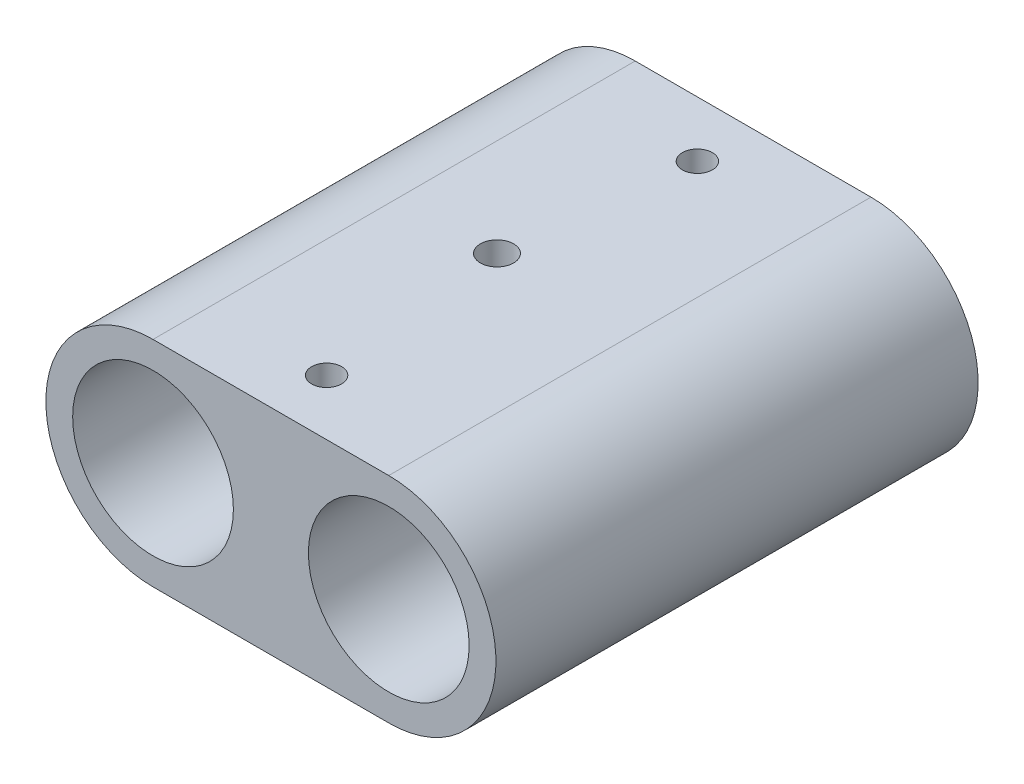
ISO-10303-21;
HEADER;
FILE_DESCRIPTION(('STEP AP214'),'2;1');
FILE_NAME('part.step','',(''),(''),'','','');
FILE_SCHEMA(('AUTOMOTIVE_DESIGN { 1 0 10303 214 1 1 1 1 }'));
ENDSEC;
DATA;
#1=APPLICATION_CONTEXT('core data for automotive mechanical design processes');
#2=APPLICATION_PROTOCOL_DEFINITION('international standard','automotive_design',2000,#1);
#3=PRODUCT_CONTEXT('',#1,'mechanical');
#4=PRODUCT('Part','Part','',(#3));
#5=PRODUCT_RELATED_PRODUCT_CATEGORY('part','',(#4));
#6=PRODUCT_DEFINITION_FORMATION('','',#4);
#7=PRODUCT_DEFINITION_CONTEXT('part definition',#1,'design');
#8=PRODUCT_DEFINITION('design','',#6,#7);
#9=PRODUCT_DEFINITION_SHAPE('','',#8);
#10=(LENGTH_UNIT() NAMED_UNIT(*) SI_UNIT(.MILLI.,.METRE.));
#11=(NAMED_UNIT(*) PLANE_ANGLE_UNIT() SI_UNIT($,.RADIAN.));
#12=(NAMED_UNIT(*) SI_UNIT($,.STERADIAN.) SOLID_ANGLE_UNIT());
#13=UNCERTAINTY_MEASURE_WITH_UNIT(LENGTH_MEASURE(1.E-05),#10,'distance_accuracy_value','');
#14=(GEOMETRIC_REPRESENTATION_CONTEXT(3) GLOBAL_UNCERTAINTY_ASSIGNED_CONTEXT((#13)) GLOBAL_UNIT_ASSIGNED_CONTEXT((#10,
#11,#12)) REPRESENTATION_CONTEXT('',''));
#15=CARTESIAN_POINT('',(0.,0.,0.));
#16=DIRECTION('',(0.,0.,1.));
#17=DIRECTION('',(1.,0.,0.));
#18=AXIS2_PLACEMENT_3D('',#15,#16,#17);
#19=CARTESIAN_POINT('',(0.,-10.,35.8));
#20=DIRECTION('',(0.,1.,0.));
#21=DIRECTION('',(-1.,0.,0.));
#22=AXIS2_PLACEMENT_3D('',#19,#20,#21);
#23=CYLINDRICAL_SURFACE('',#22,1.4);
#24=CARTESIAN_POINT('',(0.,10.,35.8));
#25=DIRECTION('',(0.,1.,0.));
#26=DIRECTION('',(-1.,0.,0.));
#27=AXIS2_PLACEMENT_3D('',#24,#25,#26);
#28=CIRCLE('',#27,1.4);
#29=CARTESIAN_POINT('',(-1.4,10.,35.8));
#30=VERTEX_POINT('',#29);
#31=EDGE_CURVE('E160',#30,#30,#28,.T.);
#32=ORIENTED_EDGE('',*,*,#31,.T.);
#33=EDGE_LOOP('',(#32));
#34=FACE_BOUND('',#33,.T.);
#35=CARTESIAN_POINT('',(0.,-7.,35.8));
#36=DIRECTION('',(0.,-1.,0.));
#37=DIRECTION('',(1.,0.,0.));
#38=AXIS2_PLACEMENT_3D('',#35,#36,#37);
#39=CIRCLE('',#38,1.4);
#40=CARTESIAN_POINT('',(1.4,-7.,35.8));
#41=VERTEX_POINT('',#40);
#42=EDGE_CURVE('E48',#41,#41,#39,.F.);
#43=ORIENTED_EDGE('',*,*,#42,.F.);
#44=EDGE_LOOP('',(#43));
#45=FACE_BOUND('',#44,.T.);
#46=ADVANCED_FACE('F44',(#34,#45),#23,.F.);
#47=CARTESIAN_POINT('',(0.,-10.,1.19999999999999));
#48=DIRECTION('',(0.,1.,0.));
#49=DIRECTION('',(-1.,0.,0.));
#50=AXIS2_PLACEMENT_3D('',#47,#48,#49);
#51=CYLINDRICAL_SURFACE('',#50,1.4);
#52=CARTESIAN_POINT('',(0.,10.,1.19999999999999));
#53=DIRECTION('',(0.,1.,0.));
#54=DIRECTION('',(-1.,0.,0.));
#55=AXIS2_PLACEMENT_3D('',#52,#53,#54);
#56=CIRCLE('',#55,1.4);
#57=CARTESIAN_POINT('',(-1.4,10.,1.19999999999999));
#58=VERTEX_POINT('',#57);
#59=EDGE_CURVE('E175',#58,#58,#56,.T.);
#60=ORIENTED_EDGE('',*,*,#59,.T.);
#61=EDGE_LOOP('',(#60));
#62=FACE_BOUND('',#61,.T.);
#63=CARTESIAN_POINT('',(0.,-7.,1.19999999999999));
#64=DIRECTION('',(0.,-1.,0.));
#65=DIRECTION('',(1.,0.,0.));
#66=AXIS2_PLACEMENT_3D('',#63,#64,#65);
#67=CIRCLE('',#66,1.4);
#68=CARTESIAN_POINT('',(1.4,-7.,1.19999999999999));
#69=VERTEX_POINT('',#68);
#70=EDGE_CURVE('E154',#69,#69,#67,.F.);
#71=ORIENTED_EDGE('',*,*,#70,.F.);
#72=EDGE_LOOP('',(#71));
#73=FACE_BOUND('',#72,.T.);
#74=ADVANCED_FACE('F201',(#62,#73),#51,.F.);
#75=CARTESIAN_POINT('',(-11.,0.,37.));
#76=DIRECTION('',(0.,0.,-1.));
#77=DIRECTION('',(-1.,0.,0.));
#78=AXIS2_PLACEMENT_3D('',#75,#76,#77);
#79=CYLINDRICAL_SURFACE('',#78,10.);
#80=DIRECTION('',(0.,0.,-1.));
#81=VECTOR('',#80,1.);
#82=CARTESIAN_POINT('',(-11.,10.,37.));
#83=LINE('',#82,#81);
#84=CARTESIAN_POINT('',(-11.,10.,41.));
#85=VERTEX_POINT('',#84);
#86=CARTESIAN_POINT('',(-11.,10.,-4.));
#87=VERTEX_POINT('',#86);
#88=EDGE_CURVE('E61',#85,#87,#83,.T.);
#89=ORIENTED_EDGE('',*,*,#88,.T.);
#90=CARTESIAN_POINT('',(-11.,0.,-4.));
#91=DIRECTION('',(0.,0.,-1.));
#92=DIRECTION('',(1.,0.,0.));
#93=AXIS2_PLACEMENT_3D('',#90,#91,#92);
#94=CIRCLE('',#93,10.);
#95=CARTESIAN_POINT('',(-11.,-10.,-4.));
#96=VERTEX_POINT('',#95);
#97=EDGE_CURVE('E102',#96,#87,#94,.T.);
#98=ORIENTED_EDGE('',*,*,#97,.F.);
#99=DIRECTION('',(0.,0.,-1.));
#100=VECTOR('',#99,1.);
#101=CARTESIAN_POINT('',(-11.,-10.,37.));
#102=LINE('',#101,#100);
#103=CARTESIAN_POINT('',(-11.,-10.,41.));
#104=VERTEX_POINT('',#103);
#105=EDGE_CURVE('E53',#104,#96,#102,.T.);
#106=ORIENTED_EDGE('',*,*,#105,.F.);
#107=CARTESIAN_POINT('',(-11.,0.,41.));
#108=DIRECTION('',(0.,0.,1.));
#109=DIRECTION('',(1.,0.,0.));
#110=AXIS2_PLACEMENT_3D('',#107,#108,#109);
#111=CIRCLE('',#110,10.);
#112=EDGE_CURVE('E123',#85,#104,#111,.T.);
#113=ORIENTED_EDGE('',*,*,#112,.F.);
#114=EDGE_LOOP('',(#89,#98,#106,#113));
#115=FACE_BOUND('',#114,.T.);
#116=ADVANCED_FACE('F206',(#115),#79,.T.);
#117=CARTESIAN_POINT('',(-11.,-10.,37.));
#118=DIRECTION('',(0.,1.,0.));
#119=DIRECTION('',(-1.,0.,0.));
#120=AXIS2_PLACEMENT_3D('',#117,#118,#119);
#121=PLANE('',#120);
#122=CARTESIAN_POINT('',(0.,-10.,35.8));
#123=DIRECTION('',(0.,-1.,0.));
#124=DIRECTION('',(1.,0.,0.));
#125=AXIS2_PLACEMENT_3D('',#122,#123,#124);
#126=CIRCLE('',#125,2.75);
#127=CARTESIAN_POINT('',(2.75000000000001,-10.,35.8));
#128=VERTEX_POINT('',#127);
#129=EDGE_CURVE('E162',#128,#128,#126,.T.);
#130=ORIENTED_EDGE('',*,*,#129,.F.);
#131=EDGE_LOOP('',(#130));
#132=FACE_BOUND('',#131,.T.);
#133=CARTESIAN_POINT('',(0.,-10.,1.19999999999999));
#134=DIRECTION('',(0.,-1.,0.));
#135=DIRECTION('',(1.,0.,0.));
#136=AXIS2_PLACEMENT_3D('',#133,#134,#135);
#137=CIRCLE('',#136,2.75);
#138=CARTESIAN_POINT('',(2.75,-10.,1.19999999999999));
#139=VERTEX_POINT('',#138);
#140=EDGE_CURVE('E172',#139,#139,#137,.T.);
#141=ORIENTED_EDGE('',*,*,#140,.F.);
#142=EDGE_LOOP('',(#141));
#143=FACE_BOUND('',#142,.T.);
#144=CARTESIAN_POINT('',(-4.,-10.,32.5));
#145=DIRECTION('',(0.,-1.,0.));
#146=DIRECTION('',(1.,0.,0.));
#147=AXIS2_PLACEMENT_3D('',#144,#145,#146);
#148=CIRCLE('',#147,1.3);
#149=CARTESIAN_POINT('',(-2.69999999999999,-10.,32.5));
#150=VERTEX_POINT('',#149);
#151=EDGE_CURVE('E136',#150,#150,#148,.T.);
#152=ORIENTED_EDGE('',*,*,#151,.F.);
#153=EDGE_LOOP('',(#152));
#154=FACE_BOUND('',#153,.T.);
#155=CARTESIAN_POINT('',(4.,-10.,4.5));
#156=DIRECTION('',(0.,-1.,0.));
#157=DIRECTION('',(1.,0.,0.));
#158=AXIS2_PLACEMENT_3D('',#155,#156,#157);
#159=CIRCLE('',#158,1.3);
#160=CARTESIAN_POINT('',(5.3,-10.,4.5));
#161=VERTEX_POINT('',#160);
#162=EDGE_CURVE('E131',#161,#161,#159,.T.);
#163=ORIENTED_EDGE('',*,*,#162,.F.);
#164=EDGE_LOOP('',(#163));
#165=FACE_BOUND('',#164,.T.);
#166=CARTESIAN_POINT('',(-1.9,-10.,18.));
#167=DIRECTION('',(0.,-1.,0.));
#168=DIRECTION('',(1.,0.,0.));
#169=AXIS2_PLACEMENT_3D('',#166,#167,#168);
#170=CIRCLE('',#169,2.75);
#171=CARTESIAN_POINT('',(0.850000000000001,-10.,18.));
#172=VERTEX_POINT('',#171);
#173=EDGE_CURVE('E146',#172,#172,#170,.T.);
#174=ORIENTED_EDGE('',*,*,#173,.F.);
#175=EDGE_LOOP('',(#174));
#176=FACE_BOUND('',#175,.T.);
#177=ORIENTED_EDGE('',*,*,#105,.T.);
#178=DIRECTION('',(-1.,0.,0.));
#179=VECTOR('',#178,1.);
#180=CARTESIAN_POINT('',(11.,-10.,-4.));
#181=LINE('',#180,#179);
#182=CARTESIAN_POINT('',(11.,-10.,-4.));
#183=VERTEX_POINT('',#182);
#184=EDGE_CURVE('E97',#183,#96,#181,.T.);
#185=ORIENTED_EDGE('',*,*,#184,.F.);
#186=DIRECTION('',(0.,0.,-1.));
#187=VECTOR('',#186,1.);
#188=CARTESIAN_POINT('',(11.,-10.,37.));
#189=LINE('',#188,#187);
#190=CARTESIAN_POINT('',(11.0000000000001,-10.,41.));
#191=VERTEX_POINT('',#190);
#192=EDGE_CURVE('E86',#191,#183,#189,.T.);
#193=ORIENTED_EDGE('',*,*,#192,.F.);
#194=DIRECTION('',(1.,0.,0.));
#195=VECTOR('',#194,1.);
#196=CARTESIAN_POINT('',(-11.,-10.,41.));
#197=LINE('',#196,#195);
#198=EDGE_CURVE('E126',#104,#191,#197,.T.);
#199=ORIENTED_EDGE('',*,*,#198,.F.);
#200=EDGE_LOOP('',(#177,#185,#193,#199));
#201=FACE_BOUND('',#200,.T.);
#202=ADVANCED_FACE('F98',(#132,#143,#154,#165,#176,#201),#121,.F.);
#203=CARTESIAN_POINT('',(11.,0.,37.));
#204=DIRECTION('',(0.,0.,-1.));
#205=DIRECTION('',(-1.,0.,0.));
#206=AXIS2_PLACEMENT_3D('',#203,#204,#205);
#207=CYLINDRICAL_SURFACE('',#206,10.);
#208=ORIENTED_EDGE('',*,*,#192,.T.);
#209=CARTESIAN_POINT('',(11.,0.,-4.));
#210=DIRECTION('',(0.,0.,-1.));
#211=DIRECTION('',(-1.,0.,0.));
#212=AXIS2_PLACEMENT_3D('',#209,#210,#211);
#213=CIRCLE('',#212,10.);
#214=CARTESIAN_POINT('',(11.,10.,-4.));
#215=VERTEX_POINT('',#214);
#216=EDGE_CURVE('E90',#215,#183,#213,.T.);
#217=ORIENTED_EDGE('',*,*,#216,.F.);
#218=DIRECTION('',(0.,0.,-1.));
#219=VECTOR('',#218,1.);
#220=CARTESIAN_POINT('',(11.,10.,37.));
#221=LINE('',#220,#219);
#222=CARTESIAN_POINT('',(11.,10.,41.));
#223=VERTEX_POINT('',#222);
#224=EDGE_CURVE('E69',#223,#215,#221,.T.);
#225=ORIENTED_EDGE('',*,*,#224,.F.);
#226=CARTESIAN_POINT('',(11.,0.,41.));
#227=DIRECTION('',(0.,0.,1.));
#228=DIRECTION('',(-1.,0.,0.));
#229=AXIS2_PLACEMENT_3D('',#226,#227,#228);
#230=CIRCLE('',#229,10.);
#231=EDGE_CURVE('E91',#191,#223,#230,.T.);
#232=ORIENTED_EDGE('',*,*,#231,.F.);
#233=EDGE_LOOP('',(#208,#217,#225,#232));
#234=FACE_BOUND('',#233,.T.);
#235=ADVANCED_FACE('F88',(#234),#207,.T.);
#236=CARTESIAN_POINT('',(-11.,10.,37.));
#237=DIRECTION('',(0.,-1.,0.));
#238=DIRECTION('',(1.,0.,0.));
#239=AXIS2_PLACEMENT_3D('',#236,#237,#238);
#240=PLANE('',#239);
#241=ORIENTED_EDGE('',*,*,#59,.F.);
#242=EDGE_LOOP('',(#241));
#243=FACE_BOUND('',#242,.T.);
#244=ORIENTED_EDGE('',*,*,#31,.F.);
#245=EDGE_LOOP('',(#244));
#246=FACE_BOUND('',#245,.T.);
#247=CARTESIAN_POINT('',(-1.9,10.,18.));
#248=DIRECTION('',(0.,-1.,0.));
#249=DIRECTION('',(1.,0.,0.));
#250=AXIS2_PLACEMENT_3D('',#247,#248,#249);
#251=CIRCLE('',#250,1.55);
#252=CARTESIAN_POINT('',(-0.35,10.,18.));
#253=VERTEX_POINT('',#252);
#254=EDGE_CURVE('E135',#253,#253,#251,.T.);
#255=ORIENTED_EDGE('',*,*,#254,.T.);
#256=EDGE_LOOP('',(#255));
#257=FACE_BOUND('',#256,.T.);
#258=ORIENTED_EDGE('',*,*,#224,.T.);
#259=DIRECTION('',(1.,0.,0.));
#260=VECTOR('',#259,1.);
#261=CARTESIAN_POINT('',(11.,10.,-4.));
#262=LINE('',#261,#260);
#263=EDGE_CURVE('E107',#87,#215,#262,.T.);
#264=ORIENTED_EDGE('',*,*,#263,.F.);
#265=ORIENTED_EDGE('',*,*,#88,.F.);
#266=DIRECTION('',(-1.,0.,0.));
#267=VECTOR('',#266,1.);
#268=CARTESIAN_POINT('',(-11.,10.,41.));
#269=LINE('',#268,#267);
#270=EDGE_CURVE('E129',#223,#85,#269,.T.);
#271=ORIENTED_EDGE('',*,*,#270,.F.);
#272=EDGE_LOOP('',(#258,#264,#265,#271));
#273=FACE_BOUND('',#272,.T.);
#274=ADVANCED_FACE('F282',(#243,#246,#257,#273),#240,.F.);
#275=CARTESIAN_POINT('',(-11.,0.,37.));
#276=DIRECTION('',(0.,0.,-1.));
#277=DIRECTION('',(-1.,0.,0.));
#278=AXIS2_PLACEMENT_3D('',#275,#276,#277);
#279=CYLINDRICAL_SURFACE('',#278,7.5);
#280=CARTESIAN_POINT('',(-11.,0.,41.));
#281=DIRECTION('',(0.,0.,1.));
#282=DIRECTION('',(1.,0.,0.));
#283=AXIS2_PLACEMENT_3D('',#280,#281,#282);
#284=CIRCLE('',#283,7.50000000000001);
#285=CARTESIAN_POINT('',(-3.50000000000001,0.,41.));
#286=VERTEX_POINT('',#285);
#287=EDGE_CURVE('E120',#286,#286,#284,.T.);
#288=ORIENTED_EDGE('',*,*,#287,.T.);
#289=EDGE_LOOP('',(#288));
#290=FACE_BOUND('',#289,.T.);
#291=CARTESIAN_POINT('',(-11.,0.,-4.));
#292=DIRECTION('',(0.,0.,-1.));
#293=DIRECTION('',(-1.,0.,0.));
#294=AXIS2_PLACEMENT_3D('',#291,#292,#293);
#295=CIRCLE('',#294,7.5);
#296=CARTESIAN_POINT('',(-18.5,0.,-4.));
#297=VERTEX_POINT('',#296);
#298=EDGE_CURVE('E111',#297,#297,#295,.T.);
#299=ORIENTED_EDGE('',*,*,#298,.T.);
#300=EDGE_LOOP('',(#299));
#301=FACE_BOUND('',#300,.T.);
#302=ADVANCED_FACE('F182',(#290,#301),#279,.F.);
#303=CARTESIAN_POINT('',(11.,0.,37.));
#304=DIRECTION('',(0.,0.,-1.));
#305=DIRECTION('',(-1.,0.,0.));
#306=AXIS2_PLACEMENT_3D('',#303,#304,#305);
#307=CYLINDRICAL_SURFACE('',#306,7.5);
#308=CARTESIAN_POINT('',(11.,0.,41.));
#309=DIRECTION('',(0.,0.,1.));
#310=DIRECTION('',(1.,0.,0.));
#311=AXIS2_PLACEMENT_3D('',#308,#309,#310);
#312=CIRCLE('',#311,7.49999999999998);
#313=CARTESIAN_POINT('',(18.5,0.,41.));
#314=VERTEX_POINT('',#313);
#315=EDGE_CURVE('E117',#314,#314,#312,.T.);
#316=ORIENTED_EDGE('',*,*,#315,.T.);
#317=EDGE_LOOP('',(#316));
#318=FACE_BOUND('',#317,.T.);
#319=CARTESIAN_POINT('',(11.,0.,-4.));
#320=DIRECTION('',(0.,0.,-1.));
#321=DIRECTION('',(-1.,0.,0.));
#322=AXIS2_PLACEMENT_3D('',#319,#320,#321);
#323=CIRCLE('',#322,7.5);
#324=CARTESIAN_POINT('',(3.5,0.,-4.));
#325=VERTEX_POINT('',#324);
#326=EDGE_CURVE('E108',#325,#325,#323,.T.);
#327=ORIENTED_EDGE('',*,*,#326,.T.);
#328=EDGE_LOOP('',(#327));
#329=FACE_BOUND('',#328,.T.);
#330=ADVANCED_FACE('F262',(#318,#329),#307,.F.);
#331=CARTESIAN_POINT('',(-1.9,-4.5,18.));
#332=DIRECTION('',(0.,-1.,0.));
#333=DIRECTION('',(1.,0.,0.));
#334=AXIS2_PLACEMENT_3D('',#331,#332,#333);
#335=CYLINDRICAL_SURFACE('',#334,2.75);
#336=CARTESIAN_POINT('',(-1.9,-4.5,18.));
#337=DIRECTION('',(0.,-1.,0.));
#338=DIRECTION('',(1.,0.,0.));
#339=AXIS2_PLACEMENT_3D('',#336,#337,#338);
#340=CIRCLE('',#339,2.75);
#341=CARTESIAN_POINT('',(0.85,-4.5,18.));
#342=VERTEX_POINT('',#341);
#343=EDGE_CURVE('E147',#342,#342,#340,.T.);
#344=ORIENTED_EDGE('',*,*,#343,.F.);
#345=EDGE_LOOP('',(#344));
#346=FACE_BOUND('',#345,.T.);
#347=ORIENTED_EDGE('',*,*,#173,.T.);
#348=EDGE_LOOP('',(#347));
#349=FACE_BOUND('',#348,.T.);
#350=ADVANCED_FACE('F268',(#346,#349),#335,.F.);
#351=CARTESIAN_POINT('',(-1.9,10.,18.));
#352=DIRECTION('',(0.,-1.,0.));
#353=DIRECTION('',(1.,0.,0.));
#354=AXIS2_PLACEMENT_3D('',#351,#352,#353);
#355=CYLINDRICAL_SURFACE('',#354,1.55);
#356=CARTESIAN_POINT('',(-1.9,-3.29999999999998,18.));
#357=DIRECTION('',(0.,-1.,0.));
#358=DIRECTION('',(0.,0.,-1.));
#359=AXIS2_PLACEMENT_3D('',#356,#357,#358);
#360=CIRCLE('',#359,1.55);
#361=CARTESIAN_POINT('',(-0.349999999999999,-3.29999999999998,18.));
#362=VERTEX_POINT('',#361);
#363=EDGE_CURVE('E13',#362,#362,#360,.T.);
#364=CARTESIAN_POINT('',(-0.349999999999999,-3.29999999999998,18.));
#365=CARTESIAN_POINT('',(-0.349999999999999,-3.16145833333331,18.));
#366=CARTESIAN_POINT('',(-0.349999999999999,-3.02291666666665,18.));
#367=CARTESIAN_POINT('',(-0.349999999999999,-2.74583333333331,18.));
#368=CARTESIAN_POINT('',(-0.349999999999999,-2.60729166666665,18.));
#369=CARTESIAN_POINT('',(-0.349999999999999,-2.33020833333331,18.));
#370=CARTESIAN_POINT('',(-0.349999999999999,-2.19166666666665,18.));
#371=CARTESIAN_POINT('',(-0.349999999999999,-1.91458333333331,18.));
#372=CARTESIAN_POINT('',(-0.349999999999999,-1.77604166666665,18.));
#373=CARTESIAN_POINT('',(-0.349999999999999,-1.49895833333331,18.));
#374=CARTESIAN_POINT('',(-0.349999999999999,-1.36041666666665,18.));
#375=CARTESIAN_POINT('',(-0.349999999999999,-1.08333333333332,18.));
#376=CARTESIAN_POINT('',(-0.349999999999999,-0.944791666666649,18.));
#377=CARTESIAN_POINT('',(-0.349999999999999,-0.667708333333316,18.));
#378=CARTESIAN_POINT('',(-0.349999999999999,-0.529166666666649,18.));
#379=CARTESIAN_POINT('',(-0.349999999999999,-0.252083333333317,18.));
#380=CARTESIAN_POINT('',(-0.349999999999999,-0.11354166666665,18.));
#381=CARTESIAN_POINT('',(-0.349999999999999,0.163541666666683,18.));
#382=CARTESIAN_POINT('',(-0.35,0.302083333333349,18.));
#383=CARTESIAN_POINT('',(-0.35,0.579166666666682,18.));
#384=CARTESIAN_POINT('',(-0.35,0.717708333333348,18.));
#385=CARTESIAN_POINT('',(-0.35,0.994791666666681,18.));
#386=CARTESIAN_POINT('',(-0.35,1.13333333333335,18.));
#387=CARTESIAN_POINT('',(-0.35,1.41041666666668,18.));
#388=CARTESIAN_POINT('',(-0.35,1.54895833333335,18.));
#389=CARTESIAN_POINT('',(-0.35,1.82604166666668,18.));
#390=CARTESIAN_POINT('',(-0.35,1.96458333333335,18.));
#391=CARTESIAN_POINT('',(-0.35,2.24166666666668,18.));
#392=CARTESIAN_POINT('',(-0.35,2.38020833333335,18.));
#393=CARTESIAN_POINT('',(-0.35,2.65729166666668,18.));
#394=CARTESIAN_POINT('',(-0.35,2.79583333333335,18.));
#395=CARTESIAN_POINT('',(-0.35,3.07291666666668,18.));
#396=CARTESIAN_POINT('',(-0.35,3.21145833333335,18.));
#397=CARTESIAN_POINT('',(-0.35,3.48854166666668,18.));
#398=CARTESIAN_POINT('',(-0.35,3.62708333333334,18.));
#399=CARTESIAN_POINT('',(-0.35,3.90416666666668,18.));
#400=CARTESIAN_POINT('',(-0.35,4.04270833333334,18.));
#401=CARTESIAN_POINT('',(-0.35,4.31979166666668,18.));
#402=CARTESIAN_POINT('',(-0.35,4.45833333333334,18.));
#403=CARTESIAN_POINT('',(-0.35,4.73541666666668,18.));
#404=CARTESIAN_POINT('',(-0.35,4.87395833333334,18.));
#405=CARTESIAN_POINT('',(-0.35,5.15104166666667,18.));
#406=CARTESIAN_POINT('',(-0.35,5.28958333333334,18.));
#407=CARTESIAN_POINT('',(-0.35,5.56666666666667,18.));
#408=CARTESIAN_POINT('',(-0.35,5.70520833333334,18.));
#409=CARTESIAN_POINT('',(-0.35,5.98229166666667,18.));
#410=CARTESIAN_POINT('',(-0.35,6.12083333333334,18.));
#411=CARTESIAN_POINT('',(-0.35,6.39791666666667,18.));
#412=CARTESIAN_POINT('',(-0.35,6.53645833333334,18.));
#413=CARTESIAN_POINT('',(-0.35,6.81354166666667,18.));
#414=CARTESIAN_POINT('',(-0.35,6.95208333333334,18.));
#415=CARTESIAN_POINT('',(-0.35,7.22916666666667,18.));
#416=CARTESIAN_POINT('',(-0.35,7.36770833333334,18.));
#417=CARTESIAN_POINT('',(-0.35,7.64479166666667,18.));
#418=CARTESIAN_POINT('',(-0.35,7.78333333333334,18.));
#419=CARTESIAN_POINT('',(-0.35,8.06041666666667,18.));
#420=CARTESIAN_POINT('',(-0.35,8.19895833333334,18.));
#421=CARTESIAN_POINT('',(-0.35,8.47604166666667,18.));
#422=CARTESIAN_POINT('',(-0.35,8.61458333333334,18.));
#423=CARTESIAN_POINT('',(-0.35,8.89166666666667,18.));
#424=CARTESIAN_POINT('',(-0.35,9.03020833333334,18.));
#425=CARTESIAN_POINT('',(-0.35,9.30729166666667,18.));
#426=CARTESIAN_POINT('',(-0.35,9.44583333333334,18.));
#427=CARTESIAN_POINT('',(-0.35,9.72291666666667,18.));
#428=CARTESIAN_POINT('',(-0.35,9.86145833333333,18.));
#429=CARTESIAN_POINT('',(-0.35,10.,18.));
#430=B_SPLINE_CURVE_WITH_KNOTS('',3,(#364,#365,#366,#367,#368,#369,#370,#371,#372,#373,#374,
#375,#376,#377,#378,#379,#380,#381,#382,#383,#384,#385,#386,#387,#388,#389,#390,#391,#392,#393,
#394,#395,#396,#397,#398,#399,#400,#401,#402,#403,#404,#405,#406,#407,#408,#409,#410,#411,#412,
#413,#414,#415,#416,#417,#418,#419,#420,#421,#422,#423,#424,#425,#426,#427,#428,#429),
.UNSPECIFIED.,.F.,.F.,(4,2,2,2,2,2,2,2,2,2,2,2,2,2,2,2,2,2,2,2,2,2,2,2,2,2,2,2,2,2,2,2,4),(0.,
0.415624999999999,0.831249999999999,1.246875,1.6625,2.078125,2.49375,2.909375,3.32499999999999,
3.74062499999999,4.15624999999999,4.57187499999999,4.98749999999999,5.40312499999999,
5.81874999999999,6.23437499999999,6.64999999999999,7.06562499999999,7.48124999999999,
7.89687499999999,8.31249999999999,8.72812499999999,9.14374999999998,9.55937499999999,
9.97499999999999,10.390625,10.80625,11.221875,11.6375,12.053125,12.46875,12.884375,13.3),.UNSPECIFIED.);
#431=EDGE_CURVE('BSEAM381',#362,#253,#430,.T.);
#432=ORIENTED_EDGE('',*,*,#363,.T.);
#433=ORIENTED_EDGE('',*,*,#254,.F.);
#434=ORIENTED_EDGE('',*,*,#431,.T.);
#435=ORIENTED_EDGE('',*,*,#431,.F.);
#436=EDGE_LOOP('',(#432,#434,#433,#435));
#437=FACE_BOUND('',#436,.T.);
#438=ADVANCED_FACE('F381',(#437),#355,.F.);
#439=CARTESIAN_POINT('',(-1.9,-3.29999999999998,18.));
#440=DIRECTION('',(0.,-1.,0.));
#441=DIRECTION('',(0.,0.,-1.));
#442=AXIS2_PLACEMENT_3D('',#439,#440,#441);
#443=CONICAL_SURFACE('',#442,1.55,0.78539816339745);
#444=ORIENTED_EDGE('',*,*,#343,.T.);
#445=EDGE_LOOP('',(#444));
#446=FACE_BOUND('',#445,.T.);
#447=ORIENTED_EDGE('',*,*,#363,.F.);
#448=EDGE_LOOP('',(#447));
#449=FACE_BOUND('',#448,.T.);
#450=ADVANCED_FACE('F46',(#446,#449),#443,.F.);
#451=CARTESIAN_POINT('',(4.,-5.,4.5));
#452=DIRECTION('',(0.,-1.,0.));
#453=DIRECTION('',(1.,0.,0.));
#454=AXIS2_PLACEMENT_3D('',#451,#452,#453);
#455=CYLINDRICAL_SURFACE('',#454,1.3);
#456=CARTESIAN_POINT('',(4.,-5.,4.5));
#457=DIRECTION('',(0.,-1.,0.));
#458=DIRECTION('',(1.,0.,0.));
#459=AXIS2_PLACEMENT_3D('',#456,#457,#458);
#460=CIRCLE('',#459,1.3);
#461=CARTESIAN_POINT('',(5.3,-5.,4.5));
#462=VERTEX_POINT('',#461);
#463=EDGE_CURVE('E139',#462,#462,#460,.T.);
#464=ORIENTED_EDGE('',*,*,#463,.F.);
#465=EDGE_LOOP('',(#464));
#466=FACE_BOUND('',#465,.T.);
#467=ORIENTED_EDGE('',*,*,#162,.T.);
#468=EDGE_LOOP('',(#467));
#469=FACE_BOUND('',#468,.T.);
#470=ADVANCED_FACE('F362',(#466,#469),#455,.F.);
#471=CARTESIAN_POINT('',(4.,-5.,4.5));
#472=DIRECTION('',(0.,-1.,0.));
#473=DIRECTION('',(1.,0.,0.));
#474=AXIS2_PLACEMENT_3D('',#471,#472,#473);
#475=PLANE('',#474);
#476=ORIENTED_EDGE('',*,*,#463,.T.);
#477=EDGE_LOOP('',(#476));
#478=FACE_BOUND('',#477,.T.);
#479=ADVANCED_FACE('F352',(#478),#475,.T.);
#480=CARTESIAN_POINT('',(-4.,-5.,32.5));
#481=DIRECTION('',(0.,-1.,0.));
#482=DIRECTION('',(1.,0.,0.));
#483=AXIS2_PLACEMENT_3D('',#480,#481,#482);
#484=CYLINDRICAL_SURFACE('',#483,1.3);
#485=CARTESIAN_POINT('',(-4.,-5.,32.5));
#486=DIRECTION('',(0.,-1.,0.));
#487=DIRECTION('',(1.,0.,0.));
#488=AXIS2_PLACEMENT_3D('',#485,#486,#487);
#489=CIRCLE('',#488,1.3);
#490=CARTESIAN_POINT('',(-2.69999999999999,-5.,32.5));
#491=VERTEX_POINT('',#490);
#492=EDGE_CURVE('E132',#491,#491,#489,.T.);
#493=ORIENTED_EDGE('',*,*,#492,.F.);
#494=EDGE_LOOP('',(#493));
#495=FACE_BOUND('',#494,.T.);
#496=ORIENTED_EDGE('',*,*,#151,.T.);
#497=EDGE_LOOP('',(#496));
#498=FACE_BOUND('',#497,.T.);
#499=ADVANCED_FACE('F342',(#495,#498),#484,.F.);
#500=CARTESIAN_POINT('',(-4.,-5.,32.5));
#501=DIRECTION('',(0.,-1.,0.));
#502=DIRECTION('',(1.,0.,0.));
#503=AXIS2_PLACEMENT_3D('',#500,#501,#502);
#504=PLANE('',#503);
#505=ORIENTED_EDGE('',*,*,#492,.T.);
#506=EDGE_LOOP('',(#505));
#507=FACE_BOUND('',#506,.T.);
#508=ADVANCED_FACE('F195',(#507),#504,.T.);
#509=CARTESIAN_POINT('',(-11.,0.,41.));
#510=DIRECTION('',(0.,0.,1.));
#511=DIRECTION('',(1.,0.,0.));
#512=AXIS2_PLACEMENT_3D('',#509,#510,#511);
#513=PLANE('',#512);
#514=ORIENTED_EDGE('',*,*,#287,.F.);
#515=EDGE_LOOP('',(#514));
#516=FACE_BOUND('',#515,.T.);
#517=ORIENTED_EDGE('',*,*,#112,.T.);
#518=ORIENTED_EDGE('',*,*,#198,.T.);
#519=ORIENTED_EDGE('',*,*,#231,.T.);
#520=ORIENTED_EDGE('',*,*,#270,.T.);
#521=EDGE_LOOP('',(#517,#518,#519,#520));
#522=FACE_BOUND('',#521,.T.);
#523=ORIENTED_EDGE('',*,*,#315,.F.);
#524=EDGE_LOOP('',(#523));
#525=FACE_BOUND('',#524,.T.);
#526=ADVANCED_FACE('F185',(#516,#522,#525),#513,.T.);
#527=CARTESIAN_POINT('',(11.,0.,-4.));
#528=DIRECTION('',(0.,0.,-1.));
#529=DIRECTION('',(-1.,0.,0.));
#530=AXIS2_PLACEMENT_3D('',#527,#528,#529);
#531=PLANE('',#530);
#532=ORIENTED_EDGE('',*,*,#326,.F.);
#533=EDGE_LOOP('',(#532));
#534=FACE_BOUND('',#533,.T.);
#535=ORIENTED_EDGE('',*,*,#216,.T.);
#536=ORIENTED_EDGE('',*,*,#184,.T.);
#537=ORIENTED_EDGE('',*,*,#97,.T.);
#538=ORIENTED_EDGE('',*,*,#263,.T.);
#539=EDGE_LOOP('',(#535,#536,#537,#538));
#540=FACE_BOUND('',#539,.T.);
#541=ORIENTED_EDGE('',*,*,#298,.F.);
#542=EDGE_LOOP('',(#541));
#543=FACE_BOUND('',#542,.T.);
#544=ADVANCED_FACE('F105',(#534,#540,#543),#531,.T.);
#545=CARTESIAN_POINT('',(0.,-7.,1.19999999999999));
#546=DIRECTION('',(0.,-1.,0.));
#547=DIRECTION('',(1.,0.,0.));
#548=AXIS2_PLACEMENT_3D('',#545,#546,#547);
#549=PLANE('',#548);
#550=CARTESIAN_POINT('',(0.,-7.,1.19999999999999));
#551=DIRECTION('',(0.,-1.,0.));
#552=DIRECTION('',(1.,0.,0.));
#553=AXIS2_PLACEMENT_3D('',#550,#551,#552);
#554=CIRCLE('',#553,2.75);
#555=CARTESIAN_POINT('',(2.75,-7.,1.19999999999999));
#556=VERTEX_POINT('',#555);
#557=EDGE_CURVE('E167',#556,#556,#554,.T.);
#558=ORIENTED_EDGE('',*,*,#557,.T.);
#559=EDGE_LOOP('',(#558));
#560=FACE_BOUND('',#559,.T.);
#561=ORIENTED_EDGE('',*,*,#70,.T.);
#562=EDGE_LOOP('',(#561));
#563=FACE_BOUND('',#562,.T.);
#564=ADVANCED_FACE('F184',(#560,#563),#549,.T.);
#565=CARTESIAN_POINT('',(0.,-7.,1.19999999999999));
#566=DIRECTION('',(0.,-1.,0.));
#567=DIRECTION('',(1.,0.,0.));
#568=AXIS2_PLACEMENT_3D('',#565,#566,#567);
#569=CYLINDRICAL_SURFACE('',#568,2.75);
#570=ORIENTED_EDGE('',*,*,#557,.F.);
#571=EDGE_LOOP('',(#570));
#572=FACE_BOUND('',#571,.T.);
#573=ORIENTED_EDGE('',*,*,#140,.T.);
#574=EDGE_LOOP('',(#573));
#575=FACE_BOUND('',#574,.T.);
#576=ADVANCED_FACE('F192',(#572,#575),#569,.F.);
#577=CARTESIAN_POINT('',(0.,-7.,35.8));
#578=DIRECTION('',(0.,-1.,0.));
#579=DIRECTION('',(1.,0.,0.));
#580=AXIS2_PLACEMENT_3D('',#577,#578,#579);
#581=PLANE('',#580);
#582=CARTESIAN_POINT('',(0.,-7.,35.8));
#583=DIRECTION('',(0.,-1.,0.));
#584=DIRECTION('',(1.,0.,0.));
#585=AXIS2_PLACEMENT_3D('',#582,#583,#584);
#586=CIRCLE('',#585,2.75);
#587=CARTESIAN_POINT('',(2.75000000000001,-7.,35.8));
#588=VERTEX_POINT('',#587);
#589=EDGE_CURVE('E156',#588,#588,#586,.T.);
#590=ORIENTED_EDGE('',*,*,#589,.T.);
#591=EDGE_LOOP('',(#590));
#592=FACE_BOUND('',#591,.T.);
#593=ORIENTED_EDGE('',*,*,#42,.T.);
#594=EDGE_LOOP('',(#593));
#595=FACE_BOUND('',#594,.T.);
#596=ADVANCED_FACE('F212',(#592,#595),#581,.T.);
#597=CARTESIAN_POINT('',(0.,-7.,35.8));
#598=DIRECTION('',(0.,-1.,0.));
#599=DIRECTION('',(1.,0.,0.));
#600=AXIS2_PLACEMENT_3D('',#597,#598,#599);
#601=CYLINDRICAL_SURFACE('',#600,2.75);
#602=ORIENTED_EDGE('',*,*,#589,.F.);
#603=EDGE_LOOP('',(#602));
#604=FACE_BOUND('',#603,.T.);
#605=ORIENTED_EDGE('',*,*,#129,.T.);
#606=EDGE_LOOP('',(#605));
#607=FACE_BOUND('',#606,.T.);
#608=ADVANCED_FACE('F215',(#604,#607),#601,.F.);
#609=CLOSED_SHELL('',(#46,#74,#116,#202,#235,#274,#302,#330,#350,#438,#450,#470,#479,#499,#508,
#526,#544,#564,#576,#596,#608));
#610=MANIFOLD_SOLID_BREP('B2',#609);
#611=ADVANCED_BREP_SHAPE_REPRESENTATION('',(#18,#610),#14);
#612=SHAPE_DEFINITION_REPRESENTATION(#9,#611);
ENDSEC;
END-ISO-10303-21;
